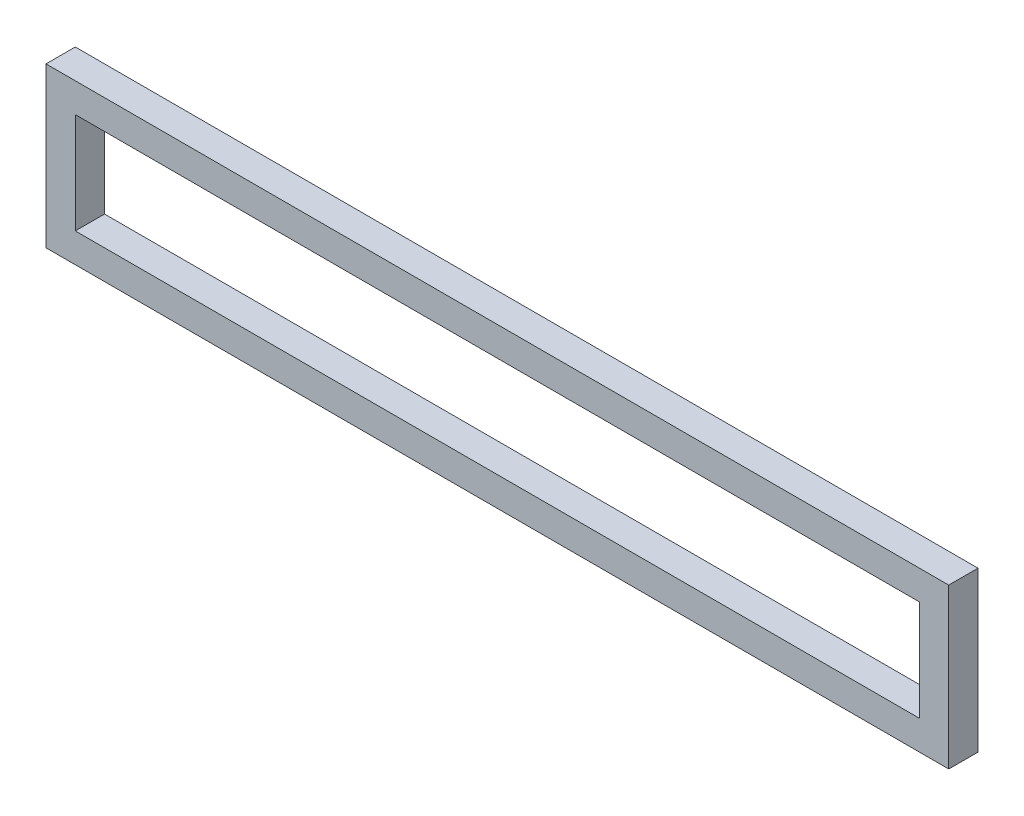
ISO-10303-21;
HEADER;
FILE_DESCRIPTION(('STEP AP214'),'2;1');
FILE_NAME('part.step','',(''),(''),'','','');
FILE_SCHEMA(('AUTOMOTIVE_DESIGN { 1 0 10303 214 1 1 1 1 }'));
ENDSEC;
DATA;
#1=APPLICATION_CONTEXT('core data for automotive mechanical design processes');
#2=APPLICATION_PROTOCOL_DEFINITION('international standard','automotive_design',2000,#1);
#3=PRODUCT_CONTEXT('',#1,'mechanical');
#4=PRODUCT('Part','Part','',(#3));
#5=PRODUCT_RELATED_PRODUCT_CATEGORY('part','',(#4));
#6=PRODUCT_DEFINITION_FORMATION('','',#4);
#7=PRODUCT_DEFINITION_CONTEXT('part definition',#1,'design');
#8=PRODUCT_DEFINITION('design','',#6,#7);
#9=PRODUCT_DEFINITION_SHAPE('','',#8);
#10=(LENGTH_UNIT() NAMED_UNIT(*) SI_UNIT(.MILLI.,.METRE.));
#11=(NAMED_UNIT(*) PLANE_ANGLE_UNIT() SI_UNIT($,.RADIAN.));
#12=(NAMED_UNIT(*) SI_UNIT($,.STERADIAN.) SOLID_ANGLE_UNIT());
#13=UNCERTAINTY_MEASURE_WITH_UNIT(LENGTH_MEASURE(1.E-05),#10,'distance_accuracy_value','');
#14=(GEOMETRIC_REPRESENTATION_CONTEXT(3) GLOBAL_UNCERTAINTY_ASSIGNED_CONTEXT((#13)) GLOBAL_UNIT_ASSIGNED_CONTEXT((#10,
#11,#12)) REPRESENTATION_CONTEXT('',''));
#15=CARTESIAN_POINT('',(0.,0.,0.));
#16=DIRECTION('',(0.,0.,1.));
#17=DIRECTION('',(1.,0.,0.));
#18=AXIS2_PLACEMENT_3D('',#15,#16,#17);
#19=CARTESIAN_POINT('',(215.9,38.1,13.9999974));
#20=DIRECTION('',(-1.,0.,0.));
#21=DIRECTION('',(0.,-1.,0.));
#22=AXIS2_PLACEMENT_3D('',#19,#20,#21);
#23=PLANE('',#22);
#24=DIRECTION('',(0.,1.,0.));
#25=VECTOR('',#24,1.);
#26=CARTESIAN_POINT('',(215.9,38.1,0.));
#27=LINE('',#26,#25);
#28=CARTESIAN_POINT('',(215.9,-38.1,0.));
#29=VERTEX_POINT('',#28);
#30=CARTESIAN_POINT('',(215.9,38.1,0.));
#31=VERTEX_POINT('',#30);
#32=EDGE_CURVE('E147',#29,#31,#27,.T.);
#33=ORIENTED_EDGE('',*,*,#32,.T.);
#34=DIRECTION('',(0.,0.,-1.));
#35=VECTOR('',#34,1.);
#36=CARTESIAN_POINT('',(215.9,38.1,13.9999974));
#37=LINE('',#36,#35);
#38=CARTESIAN_POINT('',(215.9,38.1,13.9999974));
#39=VERTEX_POINT('',#38);
#40=EDGE_CURVE('E11',#39,#31,#37,.T.);
#41=ORIENTED_EDGE('',*,*,#40,.F.);
#42=DIRECTION('',(0.,1.,0.));
#43=VECTOR('',#42,1.);
#44=CARTESIAN_POINT('',(215.9,38.1,13.9999974));
#45=LINE('',#44,#43);
#46=CARTESIAN_POINT('',(215.9,-38.1,13.9999974));
#47=VERTEX_POINT('',#46);
#48=EDGE_CURVE('E153',#47,#39,#45,.T.);
#49=ORIENTED_EDGE('',*,*,#48,.F.);
#50=DIRECTION('',(0.,0.,-1.));
#51=VECTOR('',#50,1.);
#52=CARTESIAN_POINT('',(215.9,-38.1,13.9999974));
#53=LINE('',#52,#51);
#54=EDGE_CURVE('E167',#47,#29,#53,.T.);
#55=ORIENTED_EDGE('',*,*,#54,.T.);
#56=EDGE_LOOP('',(#33,#41,#49,#55));
#57=FACE_BOUND('',#56,.T.);
#58=ADVANCED_FACE('F39',(#57),#23,.F.);
#59=CARTESIAN_POINT('',(-215.9,38.1,13.9999974));
#60=DIRECTION('',(0.,-1.,0.));
#61=DIRECTION('',(0.,0.,-1.));
#62=AXIS2_PLACEMENT_3D('',#59,#60,#61);
#63=PLANE('',#62);
#64=DIRECTION('',(-1.,0.,0.));
#65=VECTOR('',#64,1.);
#66=CARTESIAN_POINT('',(-215.9,38.1,0.));
#67=LINE('',#66,#65);
#68=CARTESIAN_POINT('',(-215.9,38.1,0.));
#69=VERTEX_POINT('',#68);
#70=EDGE_CURVE('E171',#31,#69,#67,.T.);
#71=ORIENTED_EDGE('',*,*,#70,.T.);
#72=DIRECTION('',(0.,0.,-1.));
#73=VECTOR('',#72,1.);
#74=CARTESIAN_POINT('',(-215.9,38.1,13.9999974));
#75=LINE('',#74,#73);
#76=CARTESIAN_POINT('',(-215.9,38.1,13.9999974));
#77=VERTEX_POINT('',#76);
#78=EDGE_CURVE('E47',#77,#69,#75,.T.);
#79=ORIENTED_EDGE('',*,*,#78,.F.);
#80=DIRECTION('',(-1.,0.,0.));
#81=VECTOR('',#80,1.);
#82=CARTESIAN_POINT('',(-215.9,38.1,13.9999974));
#83=LINE('',#82,#81);
#84=EDGE_CURVE('E157',#39,#77,#83,.T.);
#85=ORIENTED_EDGE('',*,*,#84,.F.);
#86=ORIENTED_EDGE('',*,*,#40,.T.);
#87=EDGE_LOOP('',(#71,#79,#85,#86));
#88=FACE_BOUND('',#87,.T.);
#89=ADVANCED_FACE('F205',(#88),#63,.F.);
#90=CARTESIAN_POINT('',(-215.9,38.1,13.9999974));
#91=DIRECTION('',(1.,0.,0.));
#92=DIRECTION('',(0.,0.,-1.));
#93=AXIS2_PLACEMENT_3D('',#90,#91,#92);
#94=PLANE('',#93);
#95=DIRECTION('',(0.,-1.,0.));
#96=VECTOR('',#95,1.);
#97=CARTESIAN_POINT('',(-215.9,38.1,0.));
#98=LINE('',#97,#96);
#99=CARTESIAN_POINT('',(-215.9,-38.1,0.));
#100=VERTEX_POINT('',#99);
#101=EDGE_CURVE('E174',#69,#100,#98,.T.);
#102=ORIENTED_EDGE('',*,*,#101,.T.);
#103=DIRECTION('',(0.,0.,-1.));
#104=VECTOR('',#103,1.);
#105=CARTESIAN_POINT('',(-215.9,-38.1,13.9999974));
#106=LINE('',#105,#104);
#107=CARTESIAN_POINT('',(-215.9,-38.1,13.9999974));
#108=VERTEX_POINT('',#107);
#109=EDGE_CURVE('E182',#108,#100,#106,.T.);
#110=ORIENTED_EDGE('',*,*,#109,.F.);
#111=DIRECTION('',(0.,-1.,0.));
#112=VECTOR('',#111,1.);
#113=CARTESIAN_POINT('',(-215.9,38.1,13.9999974));
#114=LINE('',#113,#112);
#115=EDGE_CURVE('E161',#77,#108,#114,.T.);
#116=ORIENTED_EDGE('',*,*,#115,.F.);
#117=ORIENTED_EDGE('',*,*,#78,.T.);
#118=EDGE_LOOP('',(#102,#110,#116,#117));
#119=FACE_BOUND('',#118,.T.);
#120=ADVANCED_FACE('F191',(#119),#94,.F.);
#121=CARTESIAN_POINT('',(-215.9,-38.1,13.9999974));
#122=DIRECTION('',(0.,1.,0.));
#123=DIRECTION('',(0.,0.,1.));
#124=AXIS2_PLACEMENT_3D('',#121,#122,#123);
#125=PLANE('',#124);
#126=DIRECTION('',(1.,0.,0.));
#127=VECTOR('',#126,1.);
#128=CARTESIAN_POINT('',(-215.9,-38.1,0.));
#129=LINE('',#128,#127);
#130=EDGE_CURVE('E158',#100,#29,#129,.T.);
#131=ORIENTED_EDGE('',*,*,#130,.T.);
#132=ORIENTED_EDGE('',*,*,#54,.F.);
#133=DIRECTION('',(1.,0.,0.));
#134=VECTOR('',#133,1.);
#135=CARTESIAN_POINT('',(-215.9,-38.1,13.9999974));
#136=LINE('',#135,#134);
#137=EDGE_CURVE('E164',#108,#47,#136,.T.);
#138=ORIENTED_EDGE('',*,*,#137,.F.);
#139=ORIENTED_EDGE('',*,*,#109,.T.);
#140=EDGE_LOOP('',(#131,#132,#138,#139));
#141=FACE_BOUND('',#140,.T.);
#142=ADVANCED_FACE('F198',(#141),#125,.F.);
#143=CARTESIAN_POINT('',(0.,0.,13.9999974));
#144=DIRECTION('',(0.,0.,1.));
#145=DIRECTION('',(1.,0.,0.));
#146=AXIS2_PLACEMENT_3D('',#143,#144,#145);
#147=PLANE('',#146);
#148=DIRECTION('',(-1.,0.,0.));
#149=VECTOR('',#148,1.);
#150=CARTESIAN_POINT('',(201.9000026,24.1000026,13.9999974));
#151=LINE('',#150,#149);
#152=CARTESIAN_POINT('',(201.9000026,24.1000026,13.9999974));
#153=VERTEX_POINT('',#152);
#154=CARTESIAN_POINT('',(-201.9000026,24.1000026,13.9999974));
#155=VERTEX_POINT('',#154);
#156=EDGE_CURVE('E54',#153,#155,#151,.T.);
#157=ORIENTED_EDGE('',*,*,#156,.F.);
#158=DIRECTION('',(0.,1.,0.));
#159=VECTOR('',#158,1.);
#160=CARTESIAN_POINT('',(201.9000026,24.1000026,13.9999974));
#161=LINE('',#160,#159);
#162=CARTESIAN_POINT('',(201.9000026,-24.1000026,13.9999974));
#163=VERTEX_POINT('',#162);
#164=EDGE_CURVE('E125',#163,#153,#161,.T.);
#165=ORIENTED_EDGE('',*,*,#164,.F.);
#166=DIRECTION('',(1.,0.,0.));
#167=VECTOR('',#166,1.);
#168=CARTESIAN_POINT('',(201.9000026,-24.1000026,13.9999974));
#169=LINE('',#168,#167);
#170=CARTESIAN_POINT('',(-201.9000026,-24.1000026,13.9999974));
#171=VERTEX_POINT('',#170);
#172=EDGE_CURVE('E129',#171,#163,#169,.T.);
#173=ORIENTED_EDGE('',*,*,#172,.F.);
#174=DIRECTION('',(0.,-1.,0.));
#175=VECTOR('',#174,1.);
#176=CARTESIAN_POINT('',(-201.9000026,24.1000026,13.9999974));
#177=LINE('',#176,#175);
#178=EDGE_CURVE('E138',#155,#171,#177,.T.);
#179=ORIENTED_EDGE('',*,*,#178,.F.);
#180=EDGE_LOOP('',(#157,#165,#173,#179));
#181=FACE_BOUND('',#180,.T.);
#182=ORIENTED_EDGE('',*,*,#48,.T.);
#183=ORIENTED_EDGE('',*,*,#84,.T.);
#184=ORIENTED_EDGE('',*,*,#115,.T.);
#185=ORIENTED_EDGE('',*,*,#137,.T.);
#186=EDGE_LOOP('',(#182,#183,#184,#185));
#187=FACE_BOUND('',#186,.T.);
#188=ADVANCED_FACE('F204',(#181,#187),#147,.T.);
#189=CARTESIAN_POINT('',(0.,0.,0.));
#190=DIRECTION('',(0.,0.,1.));
#191=DIRECTION('',(1.,0.,0.));
#192=AXIS2_PLACEMENT_3D('',#189,#190,#191);
#193=PLANE('',#192);
#194=DIRECTION('',(0.,1.,0.));
#195=VECTOR('',#194,1.);
#196=CARTESIAN_POINT('',(201.9000026,24.1000026,0.));
#197=LINE('',#196,#195);
#198=CARTESIAN_POINT('',(201.9000026,-24.1000026,0.));
#199=VERTEX_POINT('',#198);
#200=CARTESIAN_POINT('',(201.9000026,24.1000026,0.));
#201=VERTEX_POINT('',#200);
#202=EDGE_CURVE('E113',#199,#201,#197,.T.);
#203=ORIENTED_EDGE('',*,*,#202,.T.);
#204=DIRECTION('',(-1.,0.,0.));
#205=VECTOR('',#204,1.);
#206=CARTESIAN_POINT('',(201.9000026,24.1000026,0.));
#207=LINE('',#206,#205);
#208=CARTESIAN_POINT('',(-201.9000026,24.1000026,0.));
#209=VERTEX_POINT('',#208);
#210=EDGE_CURVE('E106',#201,#209,#207,.T.);
#211=ORIENTED_EDGE('',*,*,#210,.T.);
#212=DIRECTION('',(0.,-1.,0.));
#213=VECTOR('',#212,1.);
#214=CARTESIAN_POINT('',(-201.9000026,24.1000026,0.));
#215=LINE('',#214,#213);
#216=CARTESIAN_POINT('',(-201.9000026,-24.1000026,0.));
#217=VERTEX_POINT('',#216);
#218=EDGE_CURVE('E116',#209,#217,#215,.T.);
#219=ORIENTED_EDGE('',*,*,#218,.T.);
#220=DIRECTION('',(1.,0.,0.));
#221=VECTOR('',#220,1.);
#222=CARTESIAN_POINT('',(201.9000026,-24.1000026,0.));
#223=LINE('',#222,#221);
#224=EDGE_CURVE('E62',#217,#199,#223,.T.);
#225=ORIENTED_EDGE('',*,*,#224,.T.);
#226=EDGE_LOOP('',(#203,#211,#219,#225));
#227=FACE_BOUND('',#226,.T.);
#228=ORIENTED_EDGE('',*,*,#32,.F.);
#229=ORIENTED_EDGE('',*,*,#130,.F.);
#230=ORIENTED_EDGE('',*,*,#101,.F.);
#231=ORIENTED_EDGE('',*,*,#70,.F.);
#232=EDGE_LOOP('',(#228,#229,#230,#231));
#233=FACE_BOUND('',#232,.T.);
#234=ADVANCED_FACE('F121',(#227,#233),#193,.F.);
#235=CARTESIAN_POINT('',(201.9000026,24.1000026,0.));
#236=DIRECTION('',(0.,1.,0.));
#237=DIRECTION('',(0.,0.,1.));
#238=AXIS2_PLACEMENT_3D('',#235,#236,#237);
#239=PLANE('',#238);
#240=ORIENTED_EDGE('',*,*,#156,.T.);
#241=DIRECTION('',(0.,0.,1.));
#242=VECTOR('',#241,1.);
#243=CARTESIAN_POINT('',(-201.9000026,24.1000026,0.));
#244=LINE('',#243,#242);
#245=EDGE_CURVE('E102',#209,#155,#244,.T.);
#246=ORIENTED_EDGE('',*,*,#245,.F.);
#247=ORIENTED_EDGE('',*,*,#210,.F.);
#248=DIRECTION('',(0.,0.,1.));
#249=VECTOR('',#248,1.);
#250=CARTESIAN_POINT('',(201.9000026,24.1000026,0.));
#251=LINE('',#250,#249);
#252=EDGE_CURVE('E144',#201,#153,#251,.T.);
#253=ORIENTED_EDGE('',*,*,#252,.T.);
#254=EDGE_LOOP('',(#240,#246,#247,#253));
#255=FACE_BOUND('',#254,.T.);
#256=ADVANCED_FACE('F104',(#255),#239,.F.);
#257=CARTESIAN_POINT('',(201.9000026,24.1000026,0.));
#258=DIRECTION('',(1.,0.,0.));
#259=DIRECTION('',(0.,0.,-1.));
#260=AXIS2_PLACEMENT_3D('',#257,#258,#259);
#261=PLANE('',#260);
#262=ORIENTED_EDGE('',*,*,#164,.T.);
#263=ORIENTED_EDGE('',*,*,#252,.F.);
#264=ORIENTED_EDGE('',*,*,#202,.F.);
#265=DIRECTION('',(0.,0.,1.));
#266=VECTOR('',#265,1.);
#267=CARTESIAN_POINT('',(201.9000026,-24.1000026,0.));
#268=LINE('',#267,#266);
#269=EDGE_CURVE('E148',#199,#163,#268,.T.);
#270=ORIENTED_EDGE('',*,*,#269,.T.);
#271=EDGE_LOOP('',(#262,#263,#264,#270));
#272=FACE_BOUND('',#271,.T.);
#273=ADVANCED_FACE('F222',(#272),#261,.F.);
#274=CARTESIAN_POINT('',(201.9000026,-24.1000026,0.));
#275=DIRECTION('',(0.,-1.,0.));
#276=DIRECTION('',(0.,0.,-1.));
#277=AXIS2_PLACEMENT_3D('',#274,#275,#276);
#278=PLANE('',#277);
#279=ORIENTED_EDGE('',*,*,#172,.T.);
#280=ORIENTED_EDGE('',*,*,#269,.F.);
#281=ORIENTED_EDGE('',*,*,#224,.F.);
#282=DIRECTION('',(0.,0.,1.));
#283=VECTOR('',#282,1.);
#284=CARTESIAN_POINT('',(-201.9000026,-24.1000026,0.));
#285=LINE('',#284,#283);
#286=EDGE_CURVE('E112',#217,#171,#285,.T.);
#287=ORIENTED_EDGE('',*,*,#286,.T.);
#288=EDGE_LOOP('',(#279,#280,#281,#287));
#289=FACE_BOUND('',#288,.T.);
#290=ADVANCED_FACE('F225',(#289),#278,.F.);
#291=CARTESIAN_POINT('',(-201.9000026,24.1000026,0.));
#292=DIRECTION('',(-1.,0.,0.));
#293=DIRECTION('',(0.,0.,1.));
#294=AXIS2_PLACEMENT_3D('',#291,#292,#293);
#295=PLANE('',#294);
#296=ORIENTED_EDGE('',*,*,#178,.T.);
#297=ORIENTED_EDGE('',*,*,#286,.F.);
#298=ORIENTED_EDGE('',*,*,#218,.F.);
#299=ORIENTED_EDGE('',*,*,#245,.T.);
#300=EDGE_LOOP('',(#296,#297,#298,#299));
#301=FACE_BOUND('',#300,.T.);
#302=ADVANCED_FACE('F117',(#301),#295,.F.);
#303=CLOSED_SHELL('',(#58,#89,#120,#142,#188,#234,#256,#273,#290,#302));
#304=MANIFOLD_SOLID_BREP('B2',#303);
#305=ADVANCED_BREP_SHAPE_REPRESENTATION('',(#18,#304),#14);
#306=SHAPE_DEFINITION_REPRESENTATION(#9,#305);
ENDSEC;
END-ISO-10303-21;
